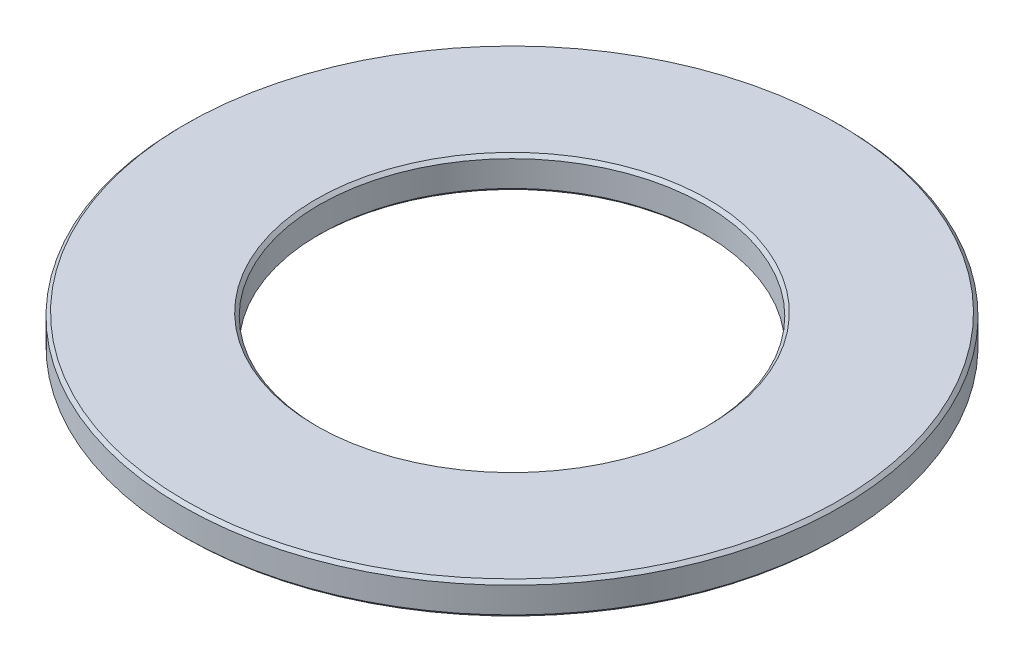
ISO-10303-21;
HEADER;
FILE_DESCRIPTION(('STEP AP214'),'2;1');
FILE_NAME('part.step','',(''),(''),'','','');
FILE_SCHEMA(('AUTOMOTIVE_DESIGN { 1 0 10303 214 1 1 1 1 }'));
ENDSEC;
DATA;
#1=APPLICATION_CONTEXT('core data for automotive mechanical design processes');
#2=APPLICATION_PROTOCOL_DEFINITION('international standard','automotive_design',2000,#1);
#3=PRODUCT_CONTEXT('',#1,'mechanical');
#4=PRODUCT('Part','Part','',(#3));
#5=PRODUCT_RELATED_PRODUCT_CATEGORY('part','',(#4));
#6=PRODUCT_DEFINITION_FORMATION('','',#4);
#7=PRODUCT_DEFINITION_CONTEXT('part definition',#1,'design');
#8=PRODUCT_DEFINITION('design','',#6,#7);
#9=PRODUCT_DEFINITION_SHAPE('','',#8);
#10=(LENGTH_UNIT() NAMED_UNIT(*) SI_UNIT(.MILLI.,.METRE.));
#11=(NAMED_UNIT(*) PLANE_ANGLE_UNIT() SI_UNIT($,.RADIAN.));
#12=(NAMED_UNIT(*) SI_UNIT($,.STERADIAN.) SOLID_ANGLE_UNIT());
#13=UNCERTAINTY_MEASURE_WITH_UNIT(LENGTH_MEASURE(1.E-05),#10,'distance_accuracy_value','');
#14=(GEOMETRIC_REPRESENTATION_CONTEXT(3) GLOBAL_UNCERTAINTY_ASSIGNED_CONTEXT((#13)) GLOBAL_UNIT_ASSIGNED_CONTEXT((#10,
#11,#12)) REPRESENTATION_CONTEXT('',''));
#15=CARTESIAN_POINT('',(0.,0.,0.));
#16=DIRECTION('',(0.,0.,1.));
#17=DIRECTION('',(1.,0.,0.));
#18=AXIS2_PLACEMENT_3D('',#15,#16,#17);
#19=CARTESIAN_POINT('',(0.,1.,0.));
#20=DIRECTION('',(0.,1.,0.));
#21=DIRECTION('',(0.,0.,1.));
#22=AXIS2_PLACEMENT_3D('',#19,#20,#21);
#23=PLANE('',#22);
#24=CARTESIAN_POINT('',(0.,1.,0.));
#25=DIRECTION('',(0.,1.,0.));
#26=DIRECTION('',(0.,0.,1.));
#27=AXIS2_PLACEMENT_3D('',#24,#25,#26);
#28=CIRCLE('',#27,6.1);
#29=CARTESIAN_POINT('',(0.,1.,6.1));
#30=VERTEX_POINT('',#29);
#31=EDGE_CURVE('E10',#30,#30,#28,.F.);
#32=ORIENTED_EDGE('',*,*,#31,.T.);
#33=EDGE_LOOP('',(#32));
#34=FACE_BOUND('',#33,.T.);
#35=CARTESIAN_POINT('',(0.,1.,0.));
#36=DIRECTION('',(0.,1.,0.));
#37=DIRECTION('',(0.,0.,1.));
#38=AXIS2_PLACEMENT_3D('',#35,#36,#37);
#39=CIRCLE('',#38,10.15);
#40=CARTESIAN_POINT('',(0.,1.,10.15));
#41=VERTEX_POINT('',#40);
#42=EDGE_CURVE('E51',#41,#41,#39,.T.);
#43=ORIENTED_EDGE('',*,*,#42,.T.);
#44=EDGE_LOOP('',(#43));
#45=FACE_BOUND('',#44,.T.);
#46=ADVANCED_FACE('F31',(#34,#45),#23,.T.);
#47=CARTESIAN_POINT('',(0.,0.,0.));
#48=DIRECTION('',(0.,1.,0.));
#49=DIRECTION('',(0.,0.,1.));
#50=AXIS2_PLACEMENT_3D('',#47,#48,#49);
#51=PLANE('',#50);
#52=CARTESIAN_POINT('',(0.,0.,0.));
#53=DIRECTION('',(0.,1.,0.));
#54=DIRECTION('',(0.,0.,1.));
#55=AXIS2_PLACEMENT_3D('',#52,#53,#54);
#56=CIRCLE('',#55,6.1);
#57=CARTESIAN_POINT('',(0.,0.,6.1));
#58=VERTEX_POINT('',#57);
#59=EDGE_CURVE('E46',#58,#58,#56,.T.);
#60=ORIENTED_EDGE('',*,*,#59,.T.);
#61=EDGE_LOOP('',(#60));
#62=FACE_BOUND('',#61,.T.);
#63=CARTESIAN_POINT('',(0.,0.,0.));
#64=DIRECTION('',(0.,1.,0.));
#65=DIRECTION('',(0.,0.,1.));
#66=AXIS2_PLACEMENT_3D('',#63,#64,#65);
#67=CIRCLE('',#66,10.15);
#68=CARTESIAN_POINT('',(0.,0.,10.15));
#69=VERTEX_POINT('',#68);
#70=EDGE_CURVE('E54',#69,#69,#67,.F.);
#71=ORIENTED_EDGE('',*,*,#70,.T.);
#72=EDGE_LOOP('',(#71));
#73=FACE_BOUND('',#72,.T.);
#74=ADVANCED_FACE('F75',(#62,#73),#51,.F.);
#75=CARTESIAN_POINT('',(0.,1.,0.));
#76=DIRECTION('',(0.,-1.,0.));
#77=DIRECTION('',(0.,0.,-1.));
#78=AXIS2_PLACEMENT_3D('',#75,#76,#77);
#79=CYLINDRICAL_SURFACE('',#78,10.25);
#80=CARTESIAN_POINT('',(0.,0.100000000000003,0.));
#81=DIRECTION('',(0.,1.,0.));
#82=DIRECTION('',(0.,0.,1.));
#83=AXIS2_PLACEMENT_3D('',#80,#81,#82);
#84=CIRCLE('',#83,10.25);
#85=CARTESIAN_POINT('',(0.,0.100000000000003,10.25));
#86=VERTEX_POINT('',#85);
#87=EDGE_CURVE('E57',#86,#86,#84,.T.);
#88=ORIENTED_EDGE('',*,*,#87,.T.);
#89=EDGE_LOOP('',(#88));
#90=FACE_BOUND('',#89,.T.);
#91=CARTESIAN_POINT('',(0.,0.900000000000002,0.));
#92=DIRECTION('',(0.,1.,0.));
#93=DIRECTION('',(0.,0.,1.));
#94=AXIS2_PLACEMENT_3D('',#91,#92,#93);
#95=CIRCLE('',#94,10.25);
#96=CARTESIAN_POINT('',(0.,0.900000000000002,10.25));
#97=VERTEX_POINT('',#96);
#98=EDGE_CURVE('E60',#97,#97,#95,.F.);
#99=ORIENTED_EDGE('',*,*,#98,.T.);
#100=EDGE_LOOP('',(#99));
#101=FACE_BOUND('',#100,.T.);
#102=ADVANCED_FACE('F64',(#90,#101),#79,.T.);
#103=CARTESIAN_POINT('',(0.,1.,0.));
#104=DIRECTION('',(0.,-1.,0.));
#105=DIRECTION('',(0.,0.,-1.));
#106=AXIS2_PLACEMENT_3D('',#103,#104,#105);
#107=CYLINDRICAL_SURFACE('',#106,6.);
#108=CARTESIAN_POINT('',(0.,0.100000000000003,0.));
#109=DIRECTION('',(0.,1.,0.));
#110=DIRECTION('',(0.,0.,1.));
#111=AXIS2_PLACEMENT_3D('',#108,#109,#110);
#112=CIRCLE('',#111,6.);
#113=CARTESIAN_POINT('',(0.,0.100000000000003,6.));
#114=VERTEX_POINT('',#113);
#115=EDGE_CURVE('E38',#114,#114,#112,.F.);
#116=ORIENTED_EDGE('',*,*,#115,.T.);
#117=EDGE_LOOP('',(#116));
#118=FACE_BOUND('',#117,.T.);
#119=CARTESIAN_POINT('',(0.,0.900000000000005,0.));
#120=DIRECTION('',(0.,1.,0.));
#121=DIRECTION('',(0.,0.,1.));
#122=AXIS2_PLACEMENT_3D('',#119,#120,#121);
#123=CIRCLE('',#122,6.);
#124=CARTESIAN_POINT('',(0.,0.900000000000005,6.));
#125=VERTEX_POINT('',#124);
#126=EDGE_CURVE('E42',#125,#125,#123,.T.);
#127=ORIENTED_EDGE('',*,*,#126,.T.);
#128=EDGE_LOOP('',(#127));
#129=FACE_BOUND('',#128,.T.);
#130=ADVANCED_FACE('F83',(#118,#129),#107,.F.);
#131=CARTESIAN_POINT('',(0.,0.100000000000003,0.));
#132=DIRECTION('',(0.,1.,0.));
#133=DIRECTION('',(0.,0.,1.));
#134=AXIS2_PLACEMENT_3D('',#131,#132,#133);
#135=CONICAL_SURFACE('',#134,10.25,0.785398163397457);
#136=ORIENTED_EDGE('',*,*,#70,.F.);
#137=EDGE_LOOP('',(#136));
#138=FACE_BOUND('',#137,.T.);
#139=ORIENTED_EDGE('',*,*,#87,.F.);
#140=EDGE_LOOP('',(#139));
#141=FACE_BOUND('',#140,.T.);
#142=ADVANCED_FACE('F70',(#138,#141),#135,.T.);
#143=CARTESIAN_POINT('',(0.,1.,0.));
#144=DIRECTION('',(0.,-1.,0.));
#145=DIRECTION('',(0.,0.,-1.));
#146=AXIS2_PLACEMENT_3D('',#143,#144,#145);
#147=CONICAL_SURFACE('',#146,10.15,0.785398163397431);
#148=ORIENTED_EDGE('',*,*,#98,.F.);
#149=EDGE_LOOP('',(#148));
#150=FACE_BOUND('',#149,.T.);
#151=ORIENTED_EDGE('',*,*,#42,.F.);
#152=EDGE_LOOP('',(#151));
#153=FACE_BOUND('',#152,.T.);
#154=ADVANCED_FACE('F66',(#150,#153),#147,.T.);
#155=CARTESIAN_POINT('',(0.,0.,0.));
#156=DIRECTION('',(0.,-1.,0.));
#157=DIRECTION('',(0.,0.,-1.));
#158=AXIS2_PLACEMENT_3D('',#155,#156,#157);
#159=CONICAL_SURFACE('',#158,6.1,0.785398163397435);
#160=ORIENTED_EDGE('',*,*,#115,.F.);
#161=EDGE_LOOP('',(#160));
#162=FACE_BOUND('',#161,.T.);
#163=ORIENTED_EDGE('',*,*,#59,.F.);
#164=EDGE_LOOP('',(#163));
#165=FACE_BOUND('',#164,.T.);
#166=ADVANCED_FACE('F69',(#162,#165),#159,.F.);
#167=CARTESIAN_POINT('',(0.,0.900000000000005,0.));
#168=DIRECTION('',(0.,1.,0.));
#169=DIRECTION('',(0.,0.,1.));
#170=AXIS2_PLACEMENT_3D('',#167,#168,#169);
#171=CONICAL_SURFACE('',#170,6.,0.785398163397457);
#172=ORIENTED_EDGE('',*,*,#31,.F.);
#173=EDGE_LOOP('',(#172));
#174=FACE_BOUND('',#173,.T.);
#175=ORIENTED_EDGE('',*,*,#126,.F.);
#176=EDGE_LOOP('',(#175));
#177=FACE_BOUND('',#176,.T.);
#178=ADVANCED_FACE('F33',(#174,#177),#171,.F.);
#179=CLOSED_SHELL('',(#46,#74,#102,#130,#142,#154,#166,#178));
#180=MANIFOLD_SOLID_BREP('B2',#179);
#181=ADVANCED_BREP_SHAPE_REPRESENTATION('',(#18,#180),#14);
#182=SHAPE_DEFINITION_REPRESENTATION(#9,#181);
ENDSEC;
END-ISO-10303-21;
